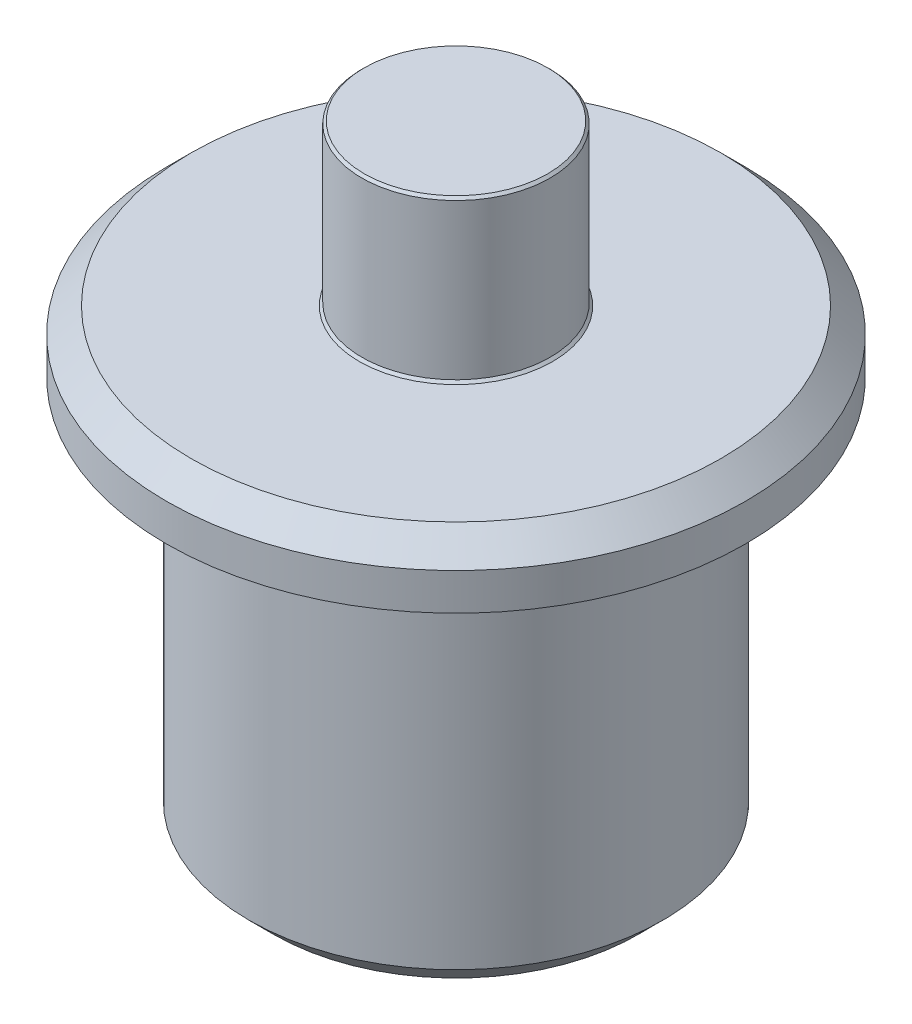
ISO-10303-21;
HEADER;
FILE_DESCRIPTION(('STEP AP214'),'2;1');
FILE_NAME('part.step','',(''),(''),'','','');
FILE_SCHEMA(('AUTOMOTIVE_DESIGN { 1 0 10303 214 1 1 1 1 }'));
ENDSEC;
DATA;
#1=APPLICATION_CONTEXT('core data for automotive mechanical design processes');
#2=APPLICATION_PROTOCOL_DEFINITION('international standard','automotive_design',2000,#1);
#3=PRODUCT_CONTEXT('',#1,'mechanical');
#4=PRODUCT('Part','Part','',(#3));
#5=PRODUCT_RELATED_PRODUCT_CATEGORY('part','',(#4));
#6=PRODUCT_DEFINITION_FORMATION('','',#4);
#7=PRODUCT_DEFINITION_CONTEXT('part definition',#1,'design');
#8=PRODUCT_DEFINITION('design','',#6,#7);
#9=PRODUCT_DEFINITION_SHAPE('','',#8);
#10=(LENGTH_UNIT() NAMED_UNIT(*) SI_UNIT(.MILLI.,.METRE.));
#11=(NAMED_UNIT(*) PLANE_ANGLE_UNIT() SI_UNIT($,.RADIAN.));
#12=(NAMED_UNIT(*) SI_UNIT($,.STERADIAN.) SOLID_ANGLE_UNIT());
#13=UNCERTAINTY_MEASURE_WITH_UNIT(LENGTH_MEASURE(1.E-05),#10,'distance_accuracy_value','');
#14=(GEOMETRIC_REPRESENTATION_CONTEXT(3) GLOBAL_UNCERTAINTY_ASSIGNED_CONTEXT((#13)) GLOBAL_UNIT_ASSIGNED_CONTEXT((#10,
#11,#12)) REPRESENTATION_CONTEXT('',''));
#15=CARTESIAN_POINT('',(0.,0.,0.));
#16=DIRECTION('',(0.,0.,1.));
#17=DIRECTION('',(1.,0.,0.));
#18=AXIS2_PLACEMENT_3D('',#15,#16,#17);
#19=CARTESIAN_POINT('',(0.,15.9,0.));
#20=DIRECTION('',(0.,-1.,0.));
#21=DIRECTION('',(0.,0.,-1.));
#22=AXIS2_PLACEMENT_3D('',#19,#20,#21);
#23=CYLINDRICAL_SURFACE('',#22,8.4);
#24=CARTESIAN_POINT('',(0.,1.,0.));
#25=DIRECTION('',(0.,1.,0.));
#26=DIRECTION('',(0.,0.,1.));
#27=AXIS2_PLACEMENT_3D('',#24,#25,#26);
#28=CIRCLE('',#27,8.4);
#29=CARTESIAN_POINT('',(0.,1.,8.4));
#30=VERTEX_POINT('',#29);
#31=EDGE_CURVE('E76',#30,#30,#28,.T.);
#32=ORIENTED_EDGE('',*,*,#31,.T.);
#33=EDGE_LOOP('',(#32));
#34=FACE_BOUND('',#33,.T.);
#35=CARTESIAN_POINT('',(0.,15.9,0.));
#36=DIRECTION('',(0.,1.,0.));
#37=DIRECTION('',(0.,0.,1.));
#38=AXIS2_PLACEMENT_3D('',#35,#36,#37);
#39=CIRCLE('',#38,8.4);
#40=CARTESIAN_POINT('',(0.,15.9,8.4));
#41=VERTEX_POINT('',#40);
#42=EDGE_CURVE('E80',#41,#41,#39,.T.);
#43=ORIENTED_EDGE('',*,*,#42,.F.);
#44=EDGE_LOOP('',(#43));
#45=FACE_BOUND('',#44,.T.);
#46=ADVANCED_FACE('F39',(#34,#45),#23,.T.);
#47=CARTESIAN_POINT('',(0.,0.,0.));
#48=DIRECTION('',(0.,1.,0.));
#49=DIRECTION('',(0.,0.,1.));
#50=AXIS2_PLACEMENT_3D('',#47,#48,#49);
#51=PLANE('',#50);
#52=CARTESIAN_POINT('',(0.,0.,0.));
#53=DIRECTION('',(0.,1.,0.));
#54=DIRECTION('',(0.,0.,1.));
#55=AXIS2_PLACEMENT_3D('',#52,#53,#54);
#56=CIRCLE('',#55,7.39999999999999);
#57=CARTESIAN_POINT('',(0.,0.,7.39999999999999));
#58=VERTEX_POINT('',#57);
#59=EDGE_CURVE('E72',#58,#58,#56,.F.);
#60=ORIENTED_EDGE('',*,*,#59,.T.);
#61=EDGE_LOOP('',(#60));
#62=FACE_BOUND('',#61,.T.);
#63=ADVANCED_FACE('F107',(#62),#51,.F.);
#64=CARTESIAN_POINT('',(0.,18.4,0.));
#65=DIRECTION('',(0.,-1.,0.));
#66=DIRECTION('',(0.,0.,-1.));
#67=AXIS2_PLACEMENT_3D('',#64,#65,#66);
#68=CYLINDRICAL_SURFACE('',#67,11.75);
#69=CARTESIAN_POINT('',(0.,17.4,0.));
#70=DIRECTION('',(0.,1.,0.));
#71=DIRECTION('',(0.,0.,1.));
#72=AXIS2_PLACEMENT_3D('',#69,#70,#71);
#73=CIRCLE('',#72,11.75);
#74=CARTESIAN_POINT('',(0.,17.4,11.75));
#75=VERTEX_POINT('',#74);
#76=EDGE_CURVE('E64',#75,#75,#73,.F.);
#77=ORIENTED_EDGE('',*,*,#76,.T.);
#78=EDGE_LOOP('',(#77));
#79=FACE_BOUND('',#78,.T.);
#80=CARTESIAN_POINT('',(0.,15.9,0.));
#81=DIRECTION('',(0.,1.,0.));
#82=DIRECTION('',(0.,0.,1.));
#83=AXIS2_PLACEMENT_3D('',#80,#81,#82);
#84=CIRCLE('',#83,11.75);
#85=CARTESIAN_POINT('',(0.,15.9,11.75));
#86=VERTEX_POINT('',#85);
#87=EDGE_CURVE('E84',#86,#86,#84,.T.);
#88=ORIENTED_EDGE('',*,*,#87,.T.);
#89=EDGE_LOOP('',(#88));
#90=FACE_BOUND('',#89,.T.);
#91=ADVANCED_FACE('F89',(#79,#90),#68,.T.);
#92=CARTESIAN_POINT('',(0.,18.4,0.));
#93=DIRECTION('',(0.,1.,0.));
#94=DIRECTION('',(0.,0.,1.));
#95=AXIS2_PLACEMENT_3D('',#92,#93,#94);
#96=PLANE('',#95);
#97=CARTESIAN_POINT('',(0.,18.4,0.));
#98=DIRECTION('',(0.,1.,0.));
#99=DIRECTION('',(0.,0.,1.));
#100=AXIS2_PLACEMENT_3D('',#97,#98,#99);
#101=CIRCLE('',#100,3.92500000000002);
#102=CARTESIAN_POINT('',(0.,18.4,3.92500000000002));
#103=VERTEX_POINT('',#102);
#104=EDGE_CURVE('E48',#103,#103,#101,.F.);
#105=ORIENTED_EDGE('',*,*,#104,.T.);
#106=EDGE_LOOP('',(#105));
#107=FACE_BOUND('',#106,.T.);
#108=CARTESIAN_POINT('',(0.,18.4,0.));
#109=DIRECTION('',(0.,1.,0.));
#110=DIRECTION('',(0.,0.,1.));
#111=AXIS2_PLACEMENT_3D('',#108,#109,#110);
#112=CIRCLE('',#111,10.75);
#113=CARTESIAN_POINT('',(0.,18.4,10.75));
#114=VERTEX_POINT('',#113);
#115=EDGE_CURVE('E68',#114,#114,#112,.T.);
#116=ORIENTED_EDGE('',*,*,#115,.T.);
#117=EDGE_LOOP('',(#116));
#118=FACE_BOUND('',#117,.T.);
#119=ADVANCED_FACE('F94',(#107,#118),#96,.T.);
#120=CARTESIAN_POINT('',(0.,15.9,0.));
#121=DIRECTION('',(0.,1.,0.));
#122=DIRECTION('',(0.,0.,1.));
#123=AXIS2_PLACEMENT_3D('',#120,#121,#122);
#124=PLANE('',#123);
#125=ORIENTED_EDGE('',*,*,#42,.T.);
#126=EDGE_LOOP('',(#125));
#127=FACE_BOUND('',#126,.T.);
#128=ORIENTED_EDGE('',*,*,#87,.F.);
#129=EDGE_LOOP('',(#128));
#130=FACE_BOUND('',#129,.T.);
#131=ADVANCED_FACE('F91',(#127,#130),#124,.F.);
#132=CARTESIAN_POINT('',(0.,24.9,0.));
#133=DIRECTION('',(0.,-1.,0.));
#134=DIRECTION('',(0.,0.,-1.));
#135=AXIS2_PLACEMENT_3D('',#132,#133,#134);
#136=CYLINDRICAL_SURFACE('',#135,3.825);
#137=CARTESIAN_POINT('',(0.,18.5,0.));
#138=DIRECTION('',(0.,1.,0.));
#139=DIRECTION('',(0.,0.,1.));
#140=AXIS2_PLACEMENT_3D('',#137,#138,#139);
#141=CIRCLE('',#140,3.825);
#142=CARTESIAN_POINT('',(0.,18.5,-3.825));
#143=VERTEX_POINT('',#142);
#144=EDGE_CURVE('E53',#143,#143,#141,.T.);
#145=CARTESIAN_POINT('',(0.,24.8,0.));
#146=DIRECTION('',(0.,1.,0.));
#147=DIRECTION('',(0.,0.,1.));
#148=AXIS2_PLACEMENT_3D('',#145,#146,#147);
#149=CIRCLE('',#148,3.825);
#150=CARTESIAN_POINT('',(0.,24.8,-3.825));
#151=VERTEX_POINT('',#150);
#152=EDGE_CURVE('E58',#151,#151,#149,.F.);
#153=CARTESIAN_POINT('',(0.,18.5,-3.825));
#154=CARTESIAN_POINT('',(0.,18.565625,-3.825));
#155=CARTESIAN_POINT('',(0.,18.63125,-3.825));
#156=CARTESIAN_POINT('',(0.,18.7625,-3.825));
#157=CARTESIAN_POINT('',(0.,18.828125,-3.825));
#158=CARTESIAN_POINT('',(0.,18.959375,-3.825));
#159=CARTESIAN_POINT('',(0.,19.025,-3.825));
#160=CARTESIAN_POINT('',(0.,19.15625,-3.825));
#161=CARTESIAN_POINT('',(0.,19.221875,-3.825));
#162=CARTESIAN_POINT('',(0.,19.353125,-3.825));
#163=CARTESIAN_POINT('',(0.,19.41875,-3.825));
#164=CARTESIAN_POINT('',(0.,19.55,-3.825));
#165=CARTESIAN_POINT('',(0.,19.615625,-3.825));
#166=CARTESIAN_POINT('',(0.,19.746875,-3.825));
#167=CARTESIAN_POINT('',(0.,19.8125,-3.825));
#168=CARTESIAN_POINT('',(0.,19.94375,-3.825));
#169=CARTESIAN_POINT('',(0.,20.009375,-3.825));
#170=CARTESIAN_POINT('',(0.,20.140625,-3.825));
#171=CARTESIAN_POINT('',(0.,20.20625,-3.825));
#172=CARTESIAN_POINT('',(0.,20.3375,-3.825));
#173=CARTESIAN_POINT('',(0.,20.403125,-3.825));
#174=CARTESIAN_POINT('',(0.,20.534375,-3.825));
#175=CARTESIAN_POINT('',(0.,20.6,-3.825));
#176=CARTESIAN_POINT('',(0.,20.73125,-3.825));
#177=CARTESIAN_POINT('',(0.,20.796875,-3.825));
#178=CARTESIAN_POINT('',(0.,20.928125,-3.825));
#179=CARTESIAN_POINT('',(0.,20.99375,-3.825));
#180=CARTESIAN_POINT('',(0.,21.125,-3.825));
#181=CARTESIAN_POINT('',(0.,21.190625,-3.825));
#182=CARTESIAN_POINT('',(0.,21.321875,-3.825));
#183=CARTESIAN_POINT('',(0.,21.3875,-3.825));
#184=CARTESIAN_POINT('',(0.,21.51875,-3.825));
#185=CARTESIAN_POINT('',(0.,21.584375,-3.825));
#186=CARTESIAN_POINT('',(0.,21.715625,-3.825));
#187=CARTESIAN_POINT('',(0.,21.78125,-3.825));
#188=CARTESIAN_POINT('',(0.,21.9125,-3.825));
#189=CARTESIAN_POINT('',(0.,21.978125,-3.825));
#190=CARTESIAN_POINT('',(0.,22.109375,-3.825));
#191=CARTESIAN_POINT('',(0.,22.175,-3.825));
#192=CARTESIAN_POINT('',(0.,22.30625,-3.825));
#193=CARTESIAN_POINT('',(0.,22.371875,-3.825));
#194=CARTESIAN_POINT('',(0.,22.503125,-3.825));
#195=CARTESIAN_POINT('',(0.,22.56875,-3.825));
#196=CARTESIAN_POINT('',(0.,22.7,-3.825));
#197=CARTESIAN_POINT('',(0.,22.765625,-3.825));
#198=CARTESIAN_POINT('',(0.,22.896875,-3.825));
#199=CARTESIAN_POINT('',(0.,22.9625,-3.825));
#200=CARTESIAN_POINT('',(0.,23.09375,-3.825));
#201=CARTESIAN_POINT('',(0.,23.159375,-3.825));
#202=CARTESIAN_POINT('',(0.,23.290625,-3.825));
#203=CARTESIAN_POINT('',(0.,23.35625,-3.825));
#204=CARTESIAN_POINT('',(0.,23.4875,-3.825));
#205=CARTESIAN_POINT('',(0.,23.553125,-3.825));
#206=CARTESIAN_POINT('',(0.,23.684375,-3.825));
#207=CARTESIAN_POINT('',(0.,23.75,-3.825));
#208=CARTESIAN_POINT('',(0.,23.88125,-3.825));
#209=CARTESIAN_POINT('',(0.,23.946875,-3.825));
#210=CARTESIAN_POINT('',(0.,24.078125,-3.825));
#211=CARTESIAN_POINT('',(0.,24.14375,-3.825));
#212=CARTESIAN_POINT('',(0.,24.275,-3.825));
#213=CARTESIAN_POINT('',(0.,24.340625,-3.825));
#214=CARTESIAN_POINT('',(0.,24.471875,-3.825));
#215=CARTESIAN_POINT('',(0.,24.5375,-3.825));
#216=CARTESIAN_POINT('',(0.,24.66875,-3.825));
#217=CARTESIAN_POINT('',(0.,24.734375,-3.825));
#218=CARTESIAN_POINT('',(0.,24.8,-3.825));
#219=B_SPLINE_CURVE_WITH_KNOTS('',3,(#153,#154,#155,#156,#157,#158,#159,#160,#161,#162,#163,
#164,#165,#166,#167,#168,#169,#170,#171,#172,#173,#174,#175,#176,#177,#178,#179,#180,#181,#182,
#183,#184,#185,#186,#187,#188,#189,#190,#191,#192,#193,#194,#195,#196,#197,#198,#199,#200,#201,
#202,#203,#204,#205,#206,#207,#208,#209,#210,#211,#212,#213,#214,#215,#216,#217,#218),
.UNSPECIFIED.,.F.,.F.,(4,2,2,2,2,2,2,2,2,2,2,2,2,2,2,2,2,2,2,2,2,2,2,2,2,2,2,2,2,2,2,2,4),(0.,
0.196875000000003,0.393750000000002,0.590625000000001,0.7875,0.984374999999999,1.18125,1.378125,
1.575,1.771875,1.96875,2.165625,2.3625,2.559375,2.75625,2.953125,3.15,3.346875,3.54375,3.740625,
3.9375,4.134375,4.33125,4.528125,4.725,4.921875,5.11875,5.315625,5.5125,5.709375,
5.90624999999999,6.10312499999999,6.3),.UNSPECIFIED.);
#220=EDGE_CURVE('BSEAM93',#143,#151,#219,.T.);
#221=ORIENTED_EDGE('',*,*,#144,.T.);
#222=ORIENTED_EDGE('',*,*,#152,.T.);
#223=ORIENTED_EDGE('',*,*,#220,.T.);
#224=ORIENTED_EDGE('',*,*,#220,.F.);
#225=EDGE_LOOP('',(#221,#223,#222,#224));
#226=FACE_BOUND('',#225,.T.);
#227=ADVANCED_FACE('F93',(#226),#136,.T.);
#228=CARTESIAN_POINT('',(0.,24.9,0.));
#229=DIRECTION('',(0.,1.,0.));
#230=DIRECTION('',(0.,0.,1.));
#231=AXIS2_PLACEMENT_3D('',#228,#229,#230);
#232=PLANE('',#231);
#233=CARTESIAN_POINT('',(0.,24.9,0.));
#234=DIRECTION('',(0.,1.,0.));
#235=DIRECTION('',(0.,0.,1.));
#236=AXIS2_PLACEMENT_3D('',#233,#234,#235);
#237=CIRCLE('',#236,3.72500000000002);
#238=CARTESIAN_POINT('',(0.,24.9,3.72500000000002));
#239=VERTEX_POINT('',#238);
#240=EDGE_CURVE('E10',#239,#239,#237,.T.);
#241=ORIENTED_EDGE('',*,*,#240,.T.);
#242=EDGE_LOOP('',(#241));
#243=FACE_BOUND('',#242,.T.);
#244=ADVANCED_FACE('F101',(#243),#232,.T.);
#245=CARTESIAN_POINT('',(0.,1.,0.));
#246=DIRECTION('',(0.,1.,0.));
#247=DIRECTION('',(0.,0.,1.));
#248=AXIS2_PLACEMENT_3D('',#245,#246,#247);
#249=CONICAL_SURFACE('',#248,8.4,0.785398163397451);
#250=ORIENTED_EDGE('',*,*,#59,.F.);
#251=EDGE_LOOP('',(#250));
#252=FACE_BOUND('',#251,.T.);
#253=ORIENTED_EDGE('',*,*,#31,.F.);
#254=EDGE_LOOP('',(#253));
#255=FACE_BOUND('',#254,.T.);
#256=ADVANCED_FACE('F118',(#252,#255),#249,.T.);
#257=CARTESIAN_POINT('',(0.,18.4,0.));
#258=DIRECTION('',(0.,-1.,0.));
#259=DIRECTION('',(0.,0.,-1.));
#260=AXIS2_PLACEMENT_3D('',#257,#258,#259);
#261=CONICAL_SURFACE('',#260,10.75,0.785398163397448);
#262=ORIENTED_EDGE('',*,*,#76,.F.);
#263=EDGE_LOOP('',(#262));
#264=FACE_BOUND('',#263,.T.);
#265=ORIENTED_EDGE('',*,*,#115,.F.);
#266=EDGE_LOOP('',(#265));
#267=FACE_BOUND('',#266,.T.);
#268=ADVANCED_FACE('F124',(#264,#267),#261,.T.);
#269=CARTESIAN_POINT('',(0.,18.5,0.));
#270=DIRECTION('',(0.,-1.,0.));
#271=DIRECTION('',(0.,0.,-1.));
#272=AXIS2_PLACEMENT_3D('',#269,#270,#271);
#273=CONICAL_SURFACE('',#272,3.825,0.785398163397422);
#274=ORIENTED_EDGE('',*,*,#104,.F.);
#275=EDGE_LOOP('',(#274));
#276=FACE_BOUND('',#275,.T.);
#277=ORIENTED_EDGE('',*,*,#144,.F.);
#278=EDGE_LOOP('',(#277));
#279=FACE_BOUND('',#278,.T.);
#280=ADVANCED_FACE('F130',(#276,#279),#273,.T.);
#281=CARTESIAN_POINT('',(0.,24.9,0.));
#282=DIRECTION('',(0.,-1.,0.));
#283=DIRECTION('',(0.,0.,-1.));
#284=AXIS2_PLACEMENT_3D('',#281,#282,#283);
#285=CONICAL_SURFACE('',#284,3.72500000000002,0.785398163397424);
#286=ORIENTED_EDGE('',*,*,#152,.F.);
#287=EDGE_LOOP('',(#286));
#288=FACE_BOUND('',#287,.T.);
#289=ORIENTED_EDGE('',*,*,#240,.F.);
#290=EDGE_LOOP('',(#289));
#291=FACE_BOUND('',#290,.T.);
#292=ADVANCED_FACE('F42',(#288,#291),#285,.T.);
#293=CLOSED_SHELL('',(#46,#63,#91,#119,#131,#227,#244,#256,#268,#280,#292));
#294=MANIFOLD_SOLID_BREP('B2',#293);
#295=ADVANCED_BREP_SHAPE_REPRESENTATION('',(#18,#294),#14);
#296=SHAPE_DEFINITION_REPRESENTATION(#9,#295);
ENDSEC;
END-ISO-10303-21;
